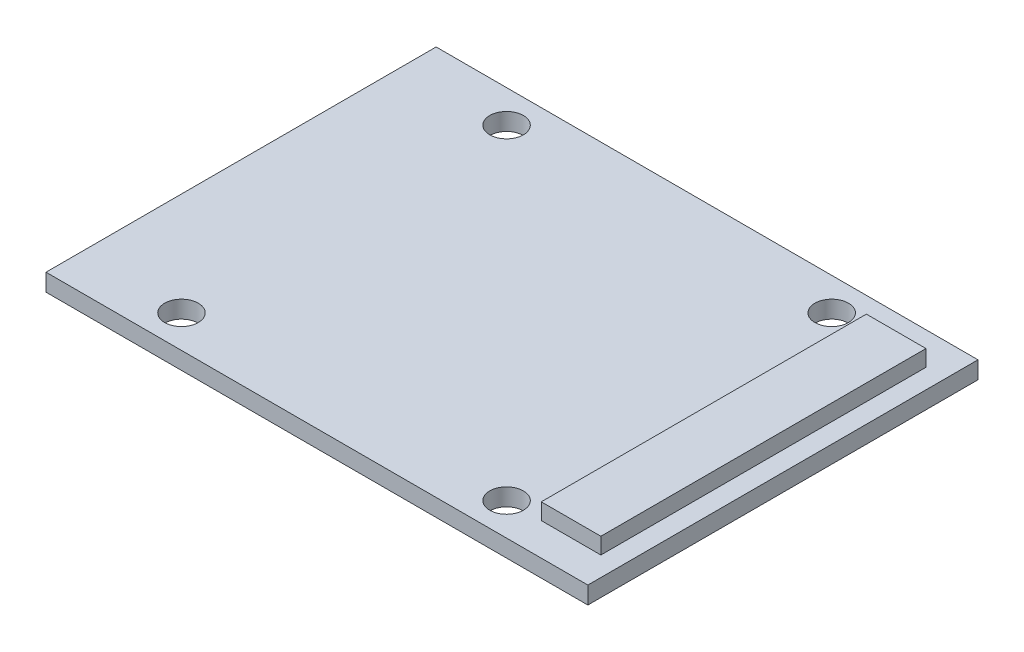
ISO-10303-21;
HEADER;
FILE_DESCRIPTION(('STEP AP214'),'2;1');
FILE_NAME('part.step','',(''),(''),'','','');
FILE_SCHEMA(('AUTOMOTIVE_DESIGN { 1 0 10303 214 1 1 1 1 }'));
ENDSEC;
DATA;
#1=APPLICATION_CONTEXT('core data for automotive mechanical design processes');
#2=APPLICATION_PROTOCOL_DEFINITION('international standard','automotive_design',2000,#1);
#3=PRODUCT_CONTEXT('',#1,'mechanical');
#4=PRODUCT('Part','Part','',(#3));
#5=PRODUCT_RELATED_PRODUCT_CATEGORY('part','',(#4));
#6=PRODUCT_DEFINITION_FORMATION('','',#4);
#7=PRODUCT_DEFINITION_CONTEXT('part definition',#1,'design');
#8=PRODUCT_DEFINITION('design','',#6,#7);
#9=PRODUCT_DEFINITION_SHAPE('','',#8);
#10=(LENGTH_UNIT() NAMED_UNIT(*) SI_UNIT(.MILLI.,.METRE.));
#11=(NAMED_UNIT(*) PLANE_ANGLE_UNIT() SI_UNIT($,.RADIAN.));
#12=(NAMED_UNIT(*) SI_UNIT($,.STERADIAN.) SOLID_ANGLE_UNIT());
#13=UNCERTAINTY_MEASURE_WITH_UNIT(LENGTH_MEASURE(1.E-05),#10,'distance_accuracy_value','');
#14=(GEOMETRIC_REPRESENTATION_CONTEXT(3) GLOBAL_UNCERTAINTY_ASSIGNED_CONTEXT((#13)) GLOBAL_UNIT_ASSIGNED_CONTEXT((#10,
#11,#12)) REPRESENTATION_CONTEXT('',''));
#15=CARTESIAN_POINT('',(0.,0.,0.));
#16=DIRECTION('',(0.,0.,1.));
#17=DIRECTION('',(1.,0.,0.));
#18=AXIS2_PLACEMENT_3D('',#15,#16,#17);
#19=CARTESIAN_POINT('',(0.,1.6,0.));
#20=DIRECTION('',(0.,-1.,0.));
#21=DIRECTION('',(0.,0.,-1.));
#22=AXIS2_PLACEMENT_3D('',#19,#20,#21);
#23=PLANE('',#22);
#24=CARTESIAN_POINT('',(14.5,1.6,15.));
#25=DIRECTION('',(0.,1.,0.));
#26=DIRECTION('',(0.,0.,-1.));
#27=AXIS2_PLACEMENT_3D('',#24,#25,#26);
#28=CIRCLE('',#27,1.55);
#29=CARTESIAN_POINT('',(14.5,1.6,13.45));
#30=VERTEX_POINT('',#29);
#31=EDGE_CURVE('E124',#30,#30,#28,.T.);
#32=ORIENTED_EDGE('',*,*,#31,.F.);
#33=EDGE_LOOP('',(#32));
#34=FACE_BOUND('',#33,.T.);
#35=CARTESIAN_POINT('',(-15.5,1.6,15.));
#36=DIRECTION('',(0.,1.,0.));
#37=DIRECTION('',(0.,0.,-1.));
#38=AXIS2_PLACEMENT_3D('',#35,#36,#37);
#39=CIRCLE('',#38,1.55);
#40=CARTESIAN_POINT('',(-15.5,1.6,13.45));
#41=VERTEX_POINT('',#40);
#42=EDGE_CURVE('E139',#41,#41,#39,.T.);
#43=ORIENTED_EDGE('',*,*,#42,.F.);
#44=EDGE_LOOP('',(#43));
#45=FACE_BOUND('',#44,.T.);
#46=DIRECTION('',(0.,0.,1.));
#47=VECTOR('',#46,1.);
#48=CARTESIAN_POINT('',(-25.,1.6,-18.));
#49=LINE('',#48,#47);
#50=CARTESIAN_POINT('',(-25.,1.6,-18.));
#51=VERTEX_POINT('',#50);
#52=CARTESIAN_POINT('',(-25.,1.6,18.));
#53=VERTEX_POINT('',#52);
#54=EDGE_CURVE('E151',#51,#53,#49,.T.);
#55=ORIENTED_EDGE('',*,*,#54,.T.);
#56=DIRECTION('',(1.,0.,0.));
#57=VECTOR('',#56,1.);
#58=CARTESIAN_POINT('',(25.,1.6,18.));
#59=LINE('',#58,#57);
#60=CARTESIAN_POINT('',(25.,1.6,18.));
#61=VERTEX_POINT('',#60);
#62=EDGE_CURVE('E154',#53,#61,#59,.T.);
#63=ORIENTED_EDGE('',*,*,#62,.T.);
#64=DIRECTION('',(0.,0.,-1.));
#65=VECTOR('',#64,1.);
#66=CARTESIAN_POINT('',(25.,1.6,-18.));
#67=LINE('',#66,#65);
#68=CARTESIAN_POINT('',(25.,1.6,-18.));
#69=VERTEX_POINT('',#68);
#70=EDGE_CURVE('E157',#61,#69,#67,.T.);
#71=ORIENTED_EDGE('',*,*,#70,.T.);
#72=DIRECTION('',(-1.,0.,0.));
#73=VECTOR('',#72,1.);
#74=CARTESIAN_POINT('',(25.,1.6,-18.));
#75=LINE('',#74,#73);
#76=EDGE_CURVE('E159',#69,#51,#75,.T.);
#77=ORIENTED_EDGE('',*,*,#76,.T.);
#78=EDGE_LOOP('',(#55,#63,#71,#77));
#79=FACE_BOUND('',#78,.T.);
#80=CARTESIAN_POINT('',(-15.5,1.6,-15.));
#81=DIRECTION('',(0.,1.,0.));
#82=DIRECTION('',(0.,0.,1.));
#83=AXIS2_PLACEMENT_3D('',#80,#81,#82);
#84=CIRCLE('',#83,1.55);
#85=CARTESIAN_POINT('',(-15.5,1.6,-13.45));
#86=VERTEX_POINT('',#85);
#87=EDGE_CURVE('E145',#86,#86,#84,.T.);
#88=ORIENTED_EDGE('',*,*,#87,.F.);
#89=EDGE_LOOP('',(#88));
#90=FACE_BOUND('',#89,.T.);
#91=CARTESIAN_POINT('',(14.5,1.6,-15.));
#92=DIRECTION('',(0.,1.,0.));
#93=DIRECTION('',(0.,0.,1.));
#94=AXIS2_PLACEMENT_3D('',#91,#92,#93);
#95=CIRCLE('',#94,1.55);
#96=CARTESIAN_POINT('',(14.5,1.6,-13.45));
#97=VERTEX_POINT('',#96);
#98=EDGE_CURVE('E133',#97,#97,#95,.T.);
#99=ORIENTED_EDGE('',*,*,#98,.F.);
#100=EDGE_LOOP('',(#99));
#101=FACE_BOUND('',#100,.T.);
#102=DIRECTION('',(0.,0.,-1.));
#103=VECTOR('',#102,1.);
#104=CARTESIAN_POINT('',(23.2,1.6,-15.));
#105=LINE('',#104,#103);
#106=CARTESIAN_POINT('',(23.2,1.6,15.));
#107=VERTEX_POINT('',#106);
#108=CARTESIAN_POINT('',(23.2,1.6,-15.));
#109=VERTEX_POINT('',#108);
#110=EDGE_CURVE('E120',#107,#109,#105,.T.);
#111=ORIENTED_EDGE('',*,*,#110,.F.);
#112=DIRECTION('',(1.,0.,0.));
#113=VECTOR('',#112,1.);
#114=CARTESIAN_POINT('',(23.2,1.6,15.));
#115=LINE('',#114,#113);
#116=CARTESIAN_POINT('',(17.7,1.6,15.));
#117=VERTEX_POINT('',#116);
#118=EDGE_CURVE('E117',#117,#107,#115,.T.);
#119=ORIENTED_EDGE('',*,*,#118,.F.);
#120=DIRECTION('',(0.,0.,1.));
#121=VECTOR('',#120,1.);
#122=CARTESIAN_POINT('',(17.7,1.6,-15.));
#123=LINE('',#122,#121);
#124=CARTESIAN_POINT('',(17.7,1.6,-15.));
#125=VERTEX_POINT('',#124);
#126=EDGE_CURVE('E55',#125,#117,#123,.T.);
#127=ORIENTED_EDGE('',*,*,#126,.F.);
#128=DIRECTION('',(-1.,0.,0.));
#129=VECTOR('',#128,1.);
#130=CARTESIAN_POINT('',(23.2,1.6,-15.));
#131=LINE('',#130,#129);
#132=EDGE_CURVE('E50',#109,#125,#131,.T.);
#133=ORIENTED_EDGE('',*,*,#132,.F.);
#134=EDGE_LOOP('',(#111,#119,#127,#133));
#135=FACE_BOUND('',#134,.T.);
#136=ADVANCED_FACE('F35',(#34,#45,#79,#90,#101,#135),#23,.F.);
#137=CARTESIAN_POINT('',(0.,0.,0.));
#138=DIRECTION('',(0.,-1.,0.));
#139=DIRECTION('',(0.,0.,-1.));
#140=AXIS2_PLACEMENT_3D('',#137,#138,#139);
#141=PLANE('',#140);
#142=CARTESIAN_POINT('',(14.5,0.,-15.));
#143=DIRECTION('',(0.,1.,0.));
#144=DIRECTION('',(0.,0.,1.));
#145=AXIS2_PLACEMENT_3D('',#142,#143,#144);
#146=CIRCLE('',#145,1.55);
#147=CARTESIAN_POINT('',(14.5,0.,-13.45));
#148=VERTEX_POINT('',#147);
#149=EDGE_CURVE('E131',#148,#148,#146,.T.);
#150=ORIENTED_EDGE('',*,*,#149,.T.);
#151=EDGE_LOOP('',(#150));
#152=FACE_BOUND('',#151,.T.);
#153=CARTESIAN_POINT('',(-15.5,0.,-15.));
#154=DIRECTION('',(0.,1.,0.));
#155=DIRECTION('',(0.,0.,1.));
#156=AXIS2_PLACEMENT_3D('',#153,#154,#155);
#157=CIRCLE('',#156,1.55);
#158=CARTESIAN_POINT('',(-15.5,0.,-13.45));
#159=VERTEX_POINT('',#158);
#160=EDGE_CURVE('E142',#159,#159,#157,.T.);
#161=ORIENTED_EDGE('',*,*,#160,.T.);
#162=EDGE_LOOP('',(#161));
#163=FACE_BOUND('',#162,.T.);
#164=DIRECTION('',(0.,0.,1.));
#165=VECTOR('',#164,1.);
#166=CARTESIAN_POINT('',(-25.,0.,-18.));
#167=LINE('',#166,#165);
#168=CARTESIAN_POINT('',(-25.,0.,-18.));
#169=VERTEX_POINT('',#168);
#170=CARTESIAN_POINT('',(-25.,0.,18.));
#171=VERTEX_POINT('',#170);
#172=EDGE_CURVE('E148',#169,#171,#167,.T.);
#173=ORIENTED_EDGE('',*,*,#172,.F.);
#174=DIRECTION('',(-1.,0.,0.));
#175=VECTOR('',#174,1.);
#176=CARTESIAN_POINT('',(25.,0.,-18.));
#177=LINE('',#176,#175);
#178=CARTESIAN_POINT('',(25.,0.,-18.));
#179=VERTEX_POINT('',#178);
#180=EDGE_CURVE('E155',#179,#169,#177,.T.);
#181=ORIENTED_EDGE('',*,*,#180,.F.);
#182=DIRECTION('',(0.,0.,-1.));
#183=VECTOR('',#182,1.);
#184=CARTESIAN_POINT('',(25.,0.,-18.));
#185=LINE('',#184,#183);
#186=CARTESIAN_POINT('',(25.,0.,18.));
#187=VERTEX_POINT('',#186);
#188=EDGE_CURVE('E166',#187,#179,#185,.T.);
#189=ORIENTED_EDGE('',*,*,#188,.F.);
#190=DIRECTION('',(1.,0.,0.));
#191=VECTOR('',#190,1.);
#192=CARTESIAN_POINT('',(25.,0.,18.));
#193=LINE('',#192,#191);
#194=EDGE_CURVE('E164',#171,#187,#193,.T.);
#195=ORIENTED_EDGE('',*,*,#194,.F.);
#196=EDGE_LOOP('',(#173,#181,#189,#195));
#197=FACE_BOUND('',#196,.T.);
#198=CARTESIAN_POINT('',(-15.5,0.,15.));
#199=DIRECTION('',(0.,1.,0.));
#200=DIRECTION('',(0.,0.,-1.));
#201=AXIS2_PLACEMENT_3D('',#198,#199,#200);
#202=CIRCLE('',#201,1.55);
#203=CARTESIAN_POINT('',(-15.5,0.,13.45));
#204=VERTEX_POINT('',#203);
#205=EDGE_CURVE('E136',#204,#204,#202,.T.);
#206=ORIENTED_EDGE('',*,*,#205,.T.);
#207=EDGE_LOOP('',(#206));
#208=FACE_BOUND('',#207,.T.);
#209=CARTESIAN_POINT('',(14.5,0.,15.));
#210=DIRECTION('',(0.,1.,0.));
#211=DIRECTION('',(0.,0.,-1.));
#212=AXIS2_PLACEMENT_3D('',#209,#210,#211);
#213=CIRCLE('',#212,1.55);
#214=CARTESIAN_POINT('',(14.5,0.,13.45));
#215=VERTEX_POINT('',#214);
#216=EDGE_CURVE('E121',#215,#215,#213,.T.);
#217=ORIENTED_EDGE('',*,*,#216,.T.);
#218=EDGE_LOOP('',(#217));
#219=FACE_BOUND('',#218,.T.);
#220=ADVANCED_FACE('F184',(#152,#163,#197,#208,#219),#141,.T.);
#221=CARTESIAN_POINT('',(-25.,1.6,-18.));
#222=DIRECTION('',(1.,0.,0.));
#223=DIRECTION('',(0.,0.,-1.));
#224=AXIS2_PLACEMENT_3D('',#221,#222,#223);
#225=PLANE('',#224);
#226=ORIENTED_EDGE('',*,*,#172,.T.);
#227=DIRECTION('',(0.,-1.,0.));
#228=VECTOR('',#227,1.);
#229=CARTESIAN_POINT('',(-25.,1.6,18.));
#230=LINE('',#229,#228);
#231=EDGE_CURVE('E11',#53,#171,#230,.T.);
#232=ORIENTED_EDGE('',*,*,#231,.F.);
#233=ORIENTED_EDGE('',*,*,#54,.F.);
#234=DIRECTION('',(0.,-1.,0.));
#235=VECTOR('',#234,1.);
#236=CARTESIAN_POINT('',(-25.,1.6,-18.));
#237=LINE('',#236,#235);
#238=EDGE_CURVE('E161',#51,#169,#237,.T.);
#239=ORIENTED_EDGE('',*,*,#238,.T.);
#240=EDGE_LOOP('',(#226,#232,#233,#239));
#241=FACE_BOUND('',#240,.T.);
#242=ADVANCED_FACE('F37',(#241),#225,.F.);
#243=CARTESIAN_POINT('',(25.,1.6,18.));
#244=DIRECTION('',(0.,0.,-1.));
#245=DIRECTION('',(-1.,0.,0.));
#246=AXIS2_PLACEMENT_3D('',#243,#244,#245);
#247=PLANE('',#246);
#248=ORIENTED_EDGE('',*,*,#194,.T.);
#249=DIRECTION('',(0.,-1.,0.));
#250=VECTOR('',#249,1.);
#251=CARTESIAN_POINT('',(25.,1.6,18.));
#252=LINE('',#251,#250);
#253=EDGE_CURVE('E43',#61,#187,#252,.T.);
#254=ORIENTED_EDGE('',*,*,#253,.F.);
#255=ORIENTED_EDGE('',*,*,#62,.F.);
#256=ORIENTED_EDGE('',*,*,#231,.T.);
#257=EDGE_LOOP('',(#248,#254,#255,#256));
#258=FACE_BOUND('',#257,.T.);
#259=ADVANCED_FACE('F195',(#258),#247,.F.);
#260=CARTESIAN_POINT('',(25.,1.6,-18.));
#261=DIRECTION('',(-1.,0.,0.));
#262=DIRECTION('',(0.,0.,1.));
#263=AXIS2_PLACEMENT_3D('',#260,#261,#262);
#264=PLANE('',#263);
#265=ORIENTED_EDGE('',*,*,#188,.T.);
#266=DIRECTION('',(0.,-1.,0.));
#267=VECTOR('',#266,1.);
#268=CARTESIAN_POINT('',(25.,1.6,-18.));
#269=LINE('',#268,#267);
#270=EDGE_CURVE('E171',#69,#179,#269,.T.);
#271=ORIENTED_EDGE('',*,*,#270,.F.);
#272=ORIENTED_EDGE('',*,*,#70,.F.);
#273=ORIENTED_EDGE('',*,*,#253,.T.);
#274=EDGE_LOOP('',(#265,#271,#272,#273));
#275=FACE_BOUND('',#274,.T.);
#276=ADVANCED_FACE('F178',(#275),#264,.F.);
#277=CARTESIAN_POINT('',(25.,1.6,-18.));
#278=DIRECTION('',(0.,0.,1.));
#279=DIRECTION('',(1.,0.,0.));
#280=AXIS2_PLACEMENT_3D('',#277,#278,#279);
#281=PLANE('',#280);
#282=ORIENTED_EDGE('',*,*,#180,.T.);
#283=ORIENTED_EDGE('',*,*,#238,.F.);
#284=ORIENTED_EDGE('',*,*,#76,.F.);
#285=ORIENTED_EDGE('',*,*,#270,.T.);
#286=EDGE_LOOP('',(#282,#283,#284,#285));
#287=FACE_BOUND('',#286,.T.);
#288=ADVANCED_FACE('F188',(#287),#281,.F.);
#289=CARTESIAN_POINT('',(-15.5,1.6,-15.));
#290=DIRECTION('',(0.,-1.,0.));
#291=DIRECTION('',(0.,0.,-1.));
#292=AXIS2_PLACEMENT_3D('',#289,#290,#291);
#293=CYLINDRICAL_SURFACE('',#292,1.55);
#294=ORIENTED_EDGE('',*,*,#87,.T.);
#295=EDGE_LOOP('',(#294));
#296=FACE_BOUND('',#295,.T.);
#297=ORIENTED_EDGE('',*,*,#160,.F.);
#298=EDGE_LOOP('',(#297));
#299=FACE_BOUND('',#298,.T.);
#300=ADVANCED_FACE('F215',(#296,#299),#293,.F.);
#301=CARTESIAN_POINT('',(-15.5,1.6,15.));
#302=DIRECTION('',(0.,-1.,0.));
#303=DIRECTION('',(0.,0.,-1.));
#304=AXIS2_PLACEMENT_3D('',#301,#302,#303);
#305=CYLINDRICAL_SURFACE('',#304,1.55);
#306=ORIENTED_EDGE('',*,*,#42,.T.);
#307=EDGE_LOOP('',(#306));
#308=FACE_BOUND('',#307,.T.);
#309=ORIENTED_EDGE('',*,*,#205,.F.);
#310=EDGE_LOOP('',(#309));
#311=FACE_BOUND('',#310,.T.);
#312=ADVANCED_FACE('F222',(#308,#311),#305,.F.);
#313=CARTESIAN_POINT('',(14.5,1.6,-15.));
#314=DIRECTION('',(0.,-1.,0.));
#315=DIRECTION('',(0.,0.,-1.));
#316=AXIS2_PLACEMENT_3D('',#313,#314,#315);
#317=CYLINDRICAL_SURFACE('',#316,1.55);
#318=ORIENTED_EDGE('',*,*,#98,.T.);
#319=EDGE_LOOP('',(#318));
#320=FACE_BOUND('',#319,.T.);
#321=ORIENTED_EDGE('',*,*,#149,.F.);
#322=EDGE_LOOP('',(#321));
#323=FACE_BOUND('',#322,.T.);
#324=ADVANCED_FACE('F227',(#320,#323),#317,.F.);
#325=CARTESIAN_POINT('',(14.5,1.6,15.));
#326=DIRECTION('',(0.,-1.,0.));
#327=DIRECTION('',(0.,0.,-1.));
#328=AXIS2_PLACEMENT_3D('',#325,#326,#327);
#329=CYLINDRICAL_SURFACE('',#328,1.55);
#330=ORIENTED_EDGE('',*,*,#31,.T.);
#331=EDGE_LOOP('',(#330));
#332=FACE_BOUND('',#331,.T.);
#333=ORIENTED_EDGE('',*,*,#216,.F.);
#334=EDGE_LOOP('',(#333));
#335=FACE_BOUND('',#334,.T.);
#336=ADVANCED_FACE('F262',(#332,#335),#329,.F.);
#337=CARTESIAN_POINT('',(23.2,3.1,-15.));
#338=DIRECTION('',(-1.,0.,0.));
#339=DIRECTION('',(0.,0.,1.));
#340=AXIS2_PLACEMENT_3D('',#337,#338,#339);
#341=PLANE('',#340);
#342=ORIENTED_EDGE('',*,*,#110,.T.);
#343=DIRECTION('',(0.,-1.,0.));
#344=VECTOR('',#343,1.);
#345=CARTESIAN_POINT('',(23.2,3.1,-15.));
#346=LINE('',#345,#344);
#347=CARTESIAN_POINT('',(23.2,3.1,-15.));
#348=VERTEX_POINT('',#347);
#349=EDGE_CURVE('E101',#348,#109,#346,.T.);
#350=ORIENTED_EDGE('',*,*,#349,.F.);
#351=DIRECTION('',(0.,0.,-1.));
#352=VECTOR('',#351,1.);
#353=CARTESIAN_POINT('',(23.2,3.1,-15.));
#354=LINE('',#353,#352);
#355=CARTESIAN_POINT('',(23.2,3.1,15.));
#356=VERTEX_POINT('',#355);
#357=EDGE_CURVE('E108',#356,#348,#354,.T.);
#358=ORIENTED_EDGE('',*,*,#357,.F.);
#359=DIRECTION('',(0.,-1.,0.));
#360=VECTOR('',#359,1.);
#361=CARTESIAN_POINT('',(23.2,3.1,15.));
#362=LINE('',#361,#360);
#363=EDGE_CURVE('E240',#356,#107,#362,.T.);
#364=ORIENTED_EDGE('',*,*,#363,.T.);
#365=EDGE_LOOP('',(#342,#350,#358,#364));
#366=FACE_BOUND('',#365,.T.);
#367=ADVANCED_FACE('F119',(#366),#341,.F.);
#368=CARTESIAN_POINT('',(23.2,3.1,-15.));
#369=DIRECTION('',(0.,0.,1.));
#370=DIRECTION('',(1.,0.,0.));
#371=AXIS2_PLACEMENT_3D('',#368,#369,#370);
#372=PLANE('',#371);
#373=ORIENTED_EDGE('',*,*,#132,.T.);
#374=DIRECTION('',(0.,-1.,0.));
#375=VECTOR('',#374,1.);
#376=CARTESIAN_POINT('',(17.7,3.1,-15.));
#377=LINE('',#376,#375);
#378=CARTESIAN_POINT('',(17.7,3.1,-15.));
#379=VERTEX_POINT('',#378);
#380=EDGE_CURVE('E104',#379,#125,#377,.T.);
#381=ORIENTED_EDGE('',*,*,#380,.F.);
#382=DIRECTION('',(-1.,0.,0.));
#383=VECTOR('',#382,1.);
#384=CARTESIAN_POINT('',(23.2,3.1,-15.));
#385=LINE('',#384,#383);
#386=EDGE_CURVE('E97',#348,#379,#385,.T.);
#387=ORIENTED_EDGE('',*,*,#386,.F.);
#388=ORIENTED_EDGE('',*,*,#349,.T.);
#389=EDGE_LOOP('',(#373,#381,#387,#388));
#390=FACE_BOUND('',#389,.T.);
#391=ADVANCED_FACE('F99',(#390),#372,.F.);
#392=CARTESIAN_POINT('',(17.7,3.1,-15.));
#393=DIRECTION('',(1.,0.,0.));
#394=DIRECTION('',(0.,0.,-1.));
#395=AXIS2_PLACEMENT_3D('',#392,#393,#394);
#396=PLANE('',#395);
#397=ORIENTED_EDGE('',*,*,#126,.T.);
#398=DIRECTION('',(0.,-1.,0.));
#399=VECTOR('',#398,1.);
#400=CARTESIAN_POINT('',(17.7,3.1,15.));
#401=LINE('',#400,#399);
#402=CARTESIAN_POINT('',(17.7,3.1,15.));
#403=VERTEX_POINT('',#402);
#404=EDGE_CURVE('E126',#403,#117,#401,.T.);
#405=ORIENTED_EDGE('',*,*,#404,.F.);
#406=DIRECTION('',(0.,0.,1.));
#407=VECTOR('',#406,1.);
#408=CARTESIAN_POINT('',(17.7,3.1,-15.));
#409=LINE('',#408,#407);
#410=EDGE_CURVE('E107',#379,#403,#409,.T.);
#411=ORIENTED_EDGE('',*,*,#410,.F.);
#412=ORIENTED_EDGE('',*,*,#380,.T.);
#413=EDGE_LOOP('',(#397,#405,#411,#412));
#414=FACE_BOUND('',#413,.T.);
#415=ADVANCED_FACE('F249',(#414),#396,.F.);
#416=CARTESIAN_POINT('',(23.2,3.1,15.));
#417=DIRECTION('',(0.,0.,-1.));
#418=DIRECTION('',(-1.,0.,0.));
#419=AXIS2_PLACEMENT_3D('',#416,#417,#418);
#420=PLANE('',#419);
#421=ORIENTED_EDGE('',*,*,#118,.T.);
#422=ORIENTED_EDGE('',*,*,#363,.F.);
#423=DIRECTION('',(1.,0.,0.));
#424=VECTOR('',#423,1.);
#425=CARTESIAN_POINT('',(23.2,3.1,15.));
#426=LINE('',#425,#424);
#427=EDGE_CURVE('E113',#403,#356,#426,.T.);
#428=ORIENTED_EDGE('',*,*,#427,.F.);
#429=ORIENTED_EDGE('',*,*,#404,.T.);
#430=EDGE_LOOP('',(#421,#422,#428,#429));
#431=FACE_BOUND('',#430,.T.);
#432=ADVANCED_FACE('F239',(#431),#420,.F.);
#433=CARTESIAN_POINT('',(0.,3.1,0.));
#434=DIRECTION('',(0.,-1.,0.));
#435=DIRECTION('',(0.,0.,-1.));
#436=AXIS2_PLACEMENT_3D('',#433,#434,#435);
#437=PLANE('',#436);
#438=ORIENTED_EDGE('',*,*,#357,.T.);
#439=ORIENTED_EDGE('',*,*,#386,.T.);
#440=ORIENTED_EDGE('',*,*,#410,.T.);
#441=ORIENTED_EDGE('',*,*,#427,.T.);
#442=EDGE_LOOP('',(#438,#439,#440,#441));
#443=FACE_BOUND('',#442,.T.);
#444=ADVANCED_FACE('F111',(#443),#437,.F.);
#445=CLOSED_SHELL('',(#136,#220,#242,#259,#276,#288,#300,#312,#324,#336,#367,#391,#415,#432,#444));
#446=MANIFOLD_SOLID_BREP('B2',#445);
#447=ADVANCED_BREP_SHAPE_REPRESENTATION('',(#18,#446),#14);
#448=SHAPE_DEFINITION_REPRESENTATION(#9,#447);
ENDSEC;
END-ISO-10303-21;
